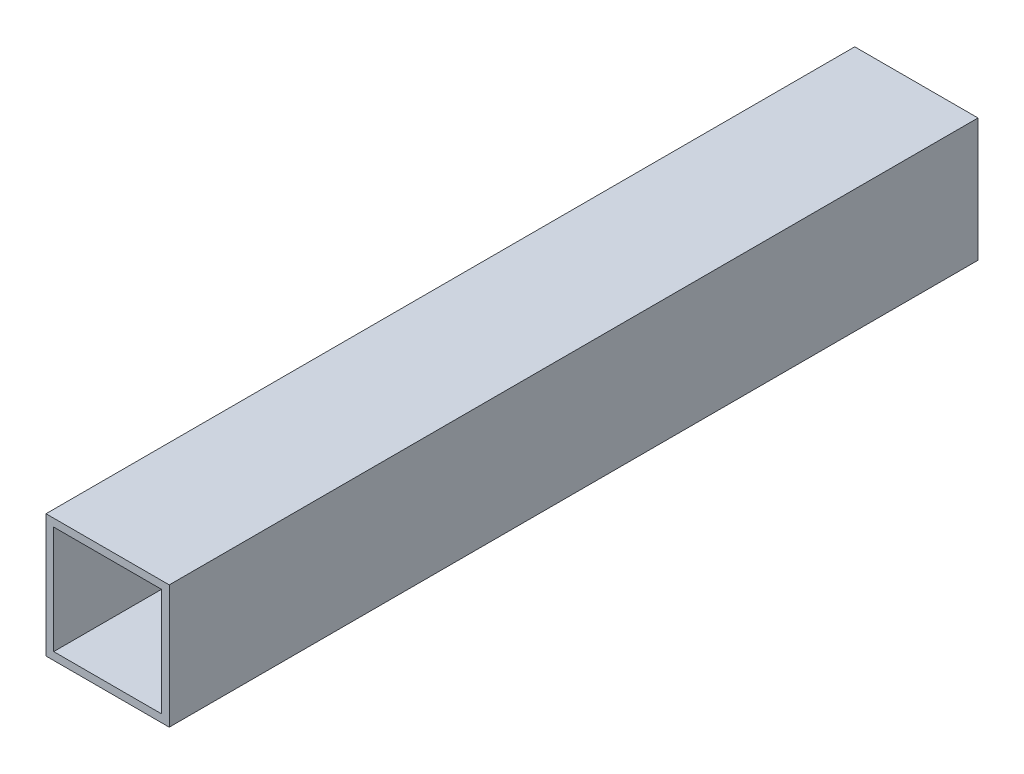
ISO-10303-21;
HEADER;
FILE_DESCRIPTION(('STEP AP214'),'2;1');
FILE_NAME('part.step','',(''),(''),'','','');
FILE_SCHEMA(('AUTOMOTIVE_DESIGN { 1 0 10303 214 1 1 1 1 }'));
ENDSEC;
DATA;
#1=APPLICATION_CONTEXT('core data for automotive mechanical design processes');
#2=APPLICATION_PROTOCOL_DEFINITION('international standard','automotive_design',2000,#1);
#3=PRODUCT_CONTEXT('',#1,'mechanical');
#4=PRODUCT('Part','Part','',(#3));
#5=PRODUCT_RELATED_PRODUCT_CATEGORY('part','',(#4));
#6=PRODUCT_DEFINITION_FORMATION('','',#4);
#7=PRODUCT_DEFINITION_CONTEXT('part definition',#1,'design');
#8=PRODUCT_DEFINITION('design','',#6,#7);
#9=PRODUCT_DEFINITION_SHAPE('','',#8);
#10=(LENGTH_UNIT() NAMED_UNIT(*) SI_UNIT(.MILLI.,.METRE.));
#11=(NAMED_UNIT(*) PLANE_ANGLE_UNIT() SI_UNIT($,.RADIAN.));
#12=(NAMED_UNIT(*) SI_UNIT($,.STERADIAN.) SOLID_ANGLE_UNIT());
#13=UNCERTAINTY_MEASURE_WITH_UNIT(LENGTH_MEASURE(1.E-05),#10,'distance_accuracy_value','');
#14=(GEOMETRIC_REPRESENTATION_CONTEXT(3) GLOBAL_UNCERTAINTY_ASSIGNED_CONTEXT((#13)) GLOBAL_UNIT_ASSIGNED_CONTEXT((#10,
#11,#12)) REPRESENTATION_CONTEXT('',''));
#15=CARTESIAN_POINT('',(0.,0.,0.));
#16=DIRECTION('',(0.,0.,1.));
#17=DIRECTION('',(1.,0.,0.));
#18=AXIS2_PLACEMENT_3D('',#15,#16,#17);
#19=CARTESIAN_POINT('',(0.,0.,500.));
#20=DIRECTION('',(0.,0.,1.));
#21=DIRECTION('',(1.,0.,0.));
#22=AXIS2_PLACEMENT_3D('',#19,#20,#21);
#23=PLANE('',#22);
#24=DIRECTION('',(0.,-1.,0.));
#25=VECTOR('',#24,1.);
#26=CARTESIAN_POINT('',(0.,0.,500.));
#27=LINE('',#26,#25);
#28=CARTESIAN_POINT('',(0.,0.,500.));
#29=VERTEX_POINT('',#28);
#30=CARTESIAN_POINT('',(0.,-76.2,500.));
#31=VERTEX_POINT('',#30);
#32=EDGE_CURVE('E136',#29,#31,#27,.T.);
#33=ORIENTED_EDGE('',*,*,#32,.T.);
#34=DIRECTION('',(1.,0.,0.));
#35=VECTOR('',#34,1.);
#36=CARTESIAN_POINT('',(0.,-76.2,500.));
#37=LINE('',#36,#35);
#38=CARTESIAN_POINT('',(76.2,-76.2,500.));
#39=VERTEX_POINT('',#38);
#40=EDGE_CURVE('E139',#31,#39,#37,.T.);
#41=ORIENTED_EDGE('',*,*,#40,.T.);
#42=DIRECTION('',(0.,1.,0.));
#43=VECTOR('',#42,1.);
#44=CARTESIAN_POINT('',(76.2,0.,500.));
#45=LINE('',#44,#43);
#46=CARTESIAN_POINT('',(76.2,0.,500.));
#47=VERTEX_POINT('',#46);
#48=EDGE_CURVE('E142',#39,#47,#45,.T.);
#49=ORIENTED_EDGE('',*,*,#48,.T.);
#50=DIRECTION('',(-1.,0.,0.));
#51=VECTOR('',#50,1.);
#52=CARTESIAN_POINT('',(0.,0.,500.));
#53=LINE('',#52,#51);
#54=EDGE_CURVE('E144',#47,#29,#53,.T.);
#55=ORIENTED_EDGE('',*,*,#54,.T.);
#56=EDGE_LOOP('',(#33,#41,#49,#55));
#57=FACE_BOUND('',#56,.T.);
#58=DIRECTION('',(1.,0.,0.));
#59=VECTOR('',#58,1.);
#60=CARTESIAN_POINT('',(4.7625,-71.4375,500.));
#61=LINE('',#60,#59);
#62=CARTESIAN_POINT('',(4.7625,-71.4375,500.));
#63=VERTEX_POINT('',#62);
#64=CARTESIAN_POINT('',(71.4375,-71.4375,500.));
#65=VERTEX_POINT('',#64);
#66=EDGE_CURVE('E108',#63,#65,#61,.T.);
#67=ORIENTED_EDGE('',*,*,#66,.F.);
#68=DIRECTION('',(0.,-1.,0.));
#69=VECTOR('',#68,1.);
#70=CARTESIAN_POINT('',(4.7625,-4.7625,500.));
#71=LINE('',#70,#69);
#72=CARTESIAN_POINT('',(4.7625,-4.7625,500.));
#73=VERTEX_POINT('',#72);
#74=EDGE_CURVE('E100',#73,#63,#71,.T.);
#75=ORIENTED_EDGE('',*,*,#74,.F.);
#76=DIRECTION('',(-1.,0.,0.));
#77=VECTOR('',#76,1.);
#78=CARTESIAN_POINT('',(4.7625,-4.7625,500.));
#79=LINE('',#78,#77);
#80=CARTESIAN_POINT('',(71.4375,-4.7625,500.));
#81=VERTEX_POINT('',#80);
#82=EDGE_CURVE('E122',#81,#73,#79,.T.);
#83=ORIENTED_EDGE('',*,*,#82,.F.);
#84=DIRECTION('',(0.,1.,0.));
#85=VECTOR('',#84,1.);
#86=CARTESIAN_POINT('',(71.4375,-4.7625,500.));
#87=LINE('',#86,#85);
#88=EDGE_CURVE('E120',#65,#81,#87,.T.);
#89=ORIENTED_EDGE('',*,*,#88,.F.);
#90=EDGE_LOOP('',(#67,#75,#83,#89));
#91=FACE_BOUND('',#90,.T.);
#92=ADVANCED_FACE('F35',(#57,#91),#23,.T.);
#93=CARTESIAN_POINT('',(0.,0.,0.));
#94=DIRECTION('',(0.,0.,1.));
#95=DIRECTION('',(1.,0.,0.));
#96=AXIS2_PLACEMENT_3D('',#93,#94,#95);
#97=PLANE('',#96);
#98=DIRECTION('',(0.,-1.,0.));
#99=VECTOR('',#98,1.);
#100=CARTESIAN_POINT('',(0.,0.,0.));
#101=LINE('',#100,#99);
#102=CARTESIAN_POINT('',(0.,0.,0.));
#103=VERTEX_POINT('',#102);
#104=CARTESIAN_POINT('',(0.,-76.2,0.));
#105=VERTEX_POINT('',#104);
#106=EDGE_CURVE('E116',#103,#105,#101,.T.);
#107=ORIENTED_EDGE('',*,*,#106,.F.);
#108=DIRECTION('',(-1.,0.,0.));
#109=VECTOR('',#108,1.);
#110=CARTESIAN_POINT('',(0.,0.,0.));
#111=LINE('',#110,#109);
#112=CARTESIAN_POINT('',(76.2,0.,0.));
#113=VERTEX_POINT('',#112);
#114=EDGE_CURVE('E140',#113,#103,#111,.T.);
#115=ORIENTED_EDGE('',*,*,#114,.F.);
#116=DIRECTION('',(0.,1.,0.));
#117=VECTOR('',#116,1.);
#118=CARTESIAN_POINT('',(76.2,0.,0.));
#119=LINE('',#118,#117);
#120=CARTESIAN_POINT('',(76.2,-76.2,0.));
#121=VERTEX_POINT('',#120);
#122=EDGE_CURVE('E151',#121,#113,#119,.T.);
#123=ORIENTED_EDGE('',*,*,#122,.F.);
#124=DIRECTION('',(1.,0.,0.));
#125=VECTOR('',#124,1.);
#126=CARTESIAN_POINT('',(0.,-76.2,0.));
#127=LINE('',#126,#125);
#128=EDGE_CURVE('E149',#105,#121,#127,.T.);
#129=ORIENTED_EDGE('',*,*,#128,.F.);
#130=EDGE_LOOP('',(#107,#115,#123,#129));
#131=FACE_BOUND('',#130,.T.);
#132=DIRECTION('',(0.,-1.,0.));
#133=VECTOR('',#132,1.);
#134=CARTESIAN_POINT('',(4.7625,-4.7625,0.));
#135=LINE('',#134,#133);
#136=CARTESIAN_POINT('',(4.7625,-4.7625,0.));
#137=VERTEX_POINT('',#136);
#138=CARTESIAN_POINT('',(4.7625,-71.4375,0.));
#139=VERTEX_POINT('',#138);
#140=EDGE_CURVE('E58',#137,#139,#135,.T.);
#141=ORIENTED_EDGE('',*,*,#140,.T.);
#142=DIRECTION('',(1.,0.,0.));
#143=VECTOR('',#142,1.);
#144=CARTESIAN_POINT('',(4.7625,-71.4375,0.));
#145=LINE('',#144,#143);
#146=CARTESIAN_POINT('',(71.4375,-71.4375,0.));
#147=VERTEX_POINT('',#146);
#148=EDGE_CURVE('E115',#139,#147,#145,.T.);
#149=ORIENTED_EDGE('',*,*,#148,.T.);
#150=DIRECTION('',(0.,1.,0.));
#151=VECTOR('',#150,1.);
#152=CARTESIAN_POINT('',(71.4375,-4.7625,0.));
#153=LINE('',#152,#151);
#154=CARTESIAN_POINT('',(71.4375,-4.7625,0.));
#155=VERTEX_POINT('',#154);
#156=EDGE_CURVE('E128',#147,#155,#153,.T.);
#157=ORIENTED_EDGE('',*,*,#156,.T.);
#158=DIRECTION('',(-1.,0.,0.));
#159=VECTOR('',#158,1.);
#160=CARTESIAN_POINT('',(4.7625,-4.7625,0.));
#161=LINE('',#160,#159);
#162=EDGE_CURVE('E109',#155,#137,#161,.T.);
#163=ORIENTED_EDGE('',*,*,#162,.T.);
#164=EDGE_LOOP('',(#141,#149,#157,#163));
#165=FACE_BOUND('',#164,.T.);
#166=ADVANCED_FACE('F169',(#131,#165),#97,.F.);
#167=CARTESIAN_POINT('',(0.,0.,500.));
#168=DIRECTION('',(1.,0.,0.));
#169=DIRECTION('',(0.,1.,0.));
#170=AXIS2_PLACEMENT_3D('',#167,#168,#169);
#171=PLANE('',#170);
#172=ORIENTED_EDGE('',*,*,#106,.T.);
#173=DIRECTION('',(0.,0.,-1.));
#174=VECTOR('',#173,1.);
#175=CARTESIAN_POINT('',(0.,-76.2,500.));
#176=LINE('',#175,#174);
#177=EDGE_CURVE('E11',#31,#105,#176,.T.);
#178=ORIENTED_EDGE('',*,*,#177,.F.);
#179=ORIENTED_EDGE('',*,*,#32,.F.);
#180=DIRECTION('',(0.,0.,-1.));
#181=VECTOR('',#180,1.);
#182=CARTESIAN_POINT('',(0.,0.,500.));
#183=LINE('',#182,#181);
#184=EDGE_CURVE('E146',#29,#103,#183,.T.);
#185=ORIENTED_EDGE('',*,*,#184,.T.);
#186=EDGE_LOOP('',(#172,#178,#179,#185));
#187=FACE_BOUND('',#186,.T.);
#188=ADVANCED_FACE('F37',(#187),#171,.F.);
#189=CARTESIAN_POINT('',(0.,-76.2,500.));
#190=DIRECTION('',(0.,1.,0.));
#191=DIRECTION('',(0.,0.,1.));
#192=AXIS2_PLACEMENT_3D('',#189,#190,#191);
#193=PLANE('',#192);
#194=ORIENTED_EDGE('',*,*,#128,.T.);
#195=DIRECTION('',(0.,0.,-1.));
#196=VECTOR('',#195,1.);
#197=CARTESIAN_POINT('',(76.2,-76.2,500.));
#198=LINE('',#197,#196);
#199=EDGE_CURVE('E43',#39,#121,#198,.T.);
#200=ORIENTED_EDGE('',*,*,#199,.F.);
#201=ORIENTED_EDGE('',*,*,#40,.F.);
#202=ORIENTED_EDGE('',*,*,#177,.T.);
#203=EDGE_LOOP('',(#194,#200,#201,#202));
#204=FACE_BOUND('',#203,.T.);
#205=ADVANCED_FACE('F179',(#204),#193,.F.);
#206=CARTESIAN_POINT('',(76.2,0.,500.));
#207=DIRECTION('',(-1.,0.,0.));
#208=DIRECTION('',(0.,-1.,0.));
#209=AXIS2_PLACEMENT_3D('',#206,#207,#208);
#210=PLANE('',#209);
#211=ORIENTED_EDGE('',*,*,#122,.T.);
#212=DIRECTION('',(0.,0.,-1.));
#213=VECTOR('',#212,1.);
#214=CARTESIAN_POINT('',(76.2,0.,500.));
#215=LINE('',#214,#213);
#216=EDGE_CURVE('E156',#47,#113,#215,.T.);
#217=ORIENTED_EDGE('',*,*,#216,.F.);
#218=ORIENTED_EDGE('',*,*,#48,.F.);
#219=ORIENTED_EDGE('',*,*,#199,.T.);
#220=EDGE_LOOP('',(#211,#217,#218,#219));
#221=FACE_BOUND('',#220,.T.);
#222=ADVANCED_FACE('F163',(#221),#210,.F.);
#223=CARTESIAN_POINT('',(0.,0.,500.));
#224=DIRECTION('',(0.,-1.,0.));
#225=DIRECTION('',(0.,0.,-1.));
#226=AXIS2_PLACEMENT_3D('',#223,#224,#225);
#227=PLANE('',#226);
#228=ORIENTED_EDGE('',*,*,#114,.T.);
#229=ORIENTED_EDGE('',*,*,#184,.F.);
#230=ORIENTED_EDGE('',*,*,#54,.F.);
#231=ORIENTED_EDGE('',*,*,#216,.T.);
#232=EDGE_LOOP('',(#228,#229,#230,#231));
#233=FACE_BOUND('',#232,.T.);
#234=ADVANCED_FACE('F173',(#233),#227,.F.);
#235=CARTESIAN_POINT('',(4.7625,-4.7625,500.));
#236=DIRECTION('',(1.,0.,0.));
#237=DIRECTION('',(0.,0.,-1.));
#238=AXIS2_PLACEMENT_3D('',#235,#236,#237);
#239=PLANE('',#238);
#240=ORIENTED_EDGE('',*,*,#140,.F.);
#241=DIRECTION('',(0.,0.,-1.));
#242=VECTOR('',#241,1.);
#243=CARTESIAN_POINT('',(4.7625,-4.7625,500.));
#244=LINE('',#243,#242);
#245=EDGE_CURVE('E104',#73,#137,#244,.T.);
#246=ORIENTED_EDGE('',*,*,#245,.F.);
#247=ORIENTED_EDGE('',*,*,#74,.T.);
#248=DIRECTION('',(0.,0.,-1.));
#249=VECTOR('',#248,1.);
#250=CARTESIAN_POINT('',(4.7625,-71.4375,500.));
#251=LINE('',#250,#249);
#252=EDGE_CURVE('E103',#63,#139,#251,.T.);
#253=ORIENTED_EDGE('',*,*,#252,.T.);
#254=EDGE_LOOP('',(#240,#246,#247,#253));
#255=FACE_BOUND('',#254,.T.);
#256=ADVANCED_FACE('F102',(#255),#239,.T.);
#257=CARTESIAN_POINT('',(4.7625,-71.4375,500.));
#258=DIRECTION('',(0.,1.,0.));
#259=DIRECTION('',(0.,0.,1.));
#260=AXIS2_PLACEMENT_3D('',#257,#258,#259);
#261=PLANE('',#260);
#262=ORIENTED_EDGE('',*,*,#148,.F.);
#263=ORIENTED_EDGE('',*,*,#252,.F.);
#264=ORIENTED_EDGE('',*,*,#66,.T.);
#265=DIRECTION('',(0.,0.,-1.));
#266=VECTOR('',#265,1.);
#267=CARTESIAN_POINT('',(71.4375,-71.4375,500.));
#268=LINE('',#267,#266);
#269=EDGE_CURVE('E117',#65,#147,#268,.T.);
#270=ORIENTED_EDGE('',*,*,#269,.T.);
#271=EDGE_LOOP('',(#262,#263,#264,#270));
#272=FACE_BOUND('',#271,.T.);
#273=ADVANCED_FACE('F112',(#272),#261,.T.);
#274=CARTESIAN_POINT('',(71.4375,-4.7625,500.));
#275=DIRECTION('',(-1.,0.,0.));
#276=DIRECTION('',(0.,0.,1.));
#277=AXIS2_PLACEMENT_3D('',#274,#275,#276);
#278=PLANE('',#277);
#279=ORIENTED_EDGE('',*,*,#156,.F.);
#280=ORIENTED_EDGE('',*,*,#269,.F.);
#281=ORIENTED_EDGE('',*,*,#88,.T.);
#282=DIRECTION('',(0.,0.,-1.));
#283=VECTOR('',#282,1.);
#284=CARTESIAN_POINT('',(71.4375,-4.7625,500.));
#285=LINE('',#284,#283);
#286=EDGE_CURVE('E50',#81,#155,#285,.T.);
#287=ORIENTED_EDGE('',*,*,#286,.T.);
#288=EDGE_LOOP('',(#279,#280,#281,#287));
#289=FACE_BOUND('',#288,.T.);
#290=ADVANCED_FACE('F202',(#289),#278,.T.);
#291=CARTESIAN_POINT('',(4.7625,-4.7625,500.));
#292=DIRECTION('',(0.,-1.,0.));
#293=DIRECTION('',(0.,0.,-1.));
#294=AXIS2_PLACEMENT_3D('',#291,#292,#293);
#295=PLANE('',#294);
#296=ORIENTED_EDGE('',*,*,#162,.F.);
#297=ORIENTED_EDGE('',*,*,#286,.F.);
#298=ORIENTED_EDGE('',*,*,#82,.T.);
#299=ORIENTED_EDGE('',*,*,#245,.T.);
#300=EDGE_LOOP('',(#296,#297,#298,#299));
#301=FACE_BOUND('',#300,.T.);
#302=ADVANCED_FACE('F206',(#301),#295,.T.);
#303=CLOSED_SHELL('',(#92,#166,#188,#205,#222,#234,#256,#273,#290,#302));
#304=MANIFOLD_SOLID_BREP('B2',#303);
#305=ADVANCED_BREP_SHAPE_REPRESENTATION('',(#18,#304),#14);
#306=SHAPE_DEFINITION_REPRESENTATION(#9,#305);
ENDSEC;
END-ISO-10303-21;
